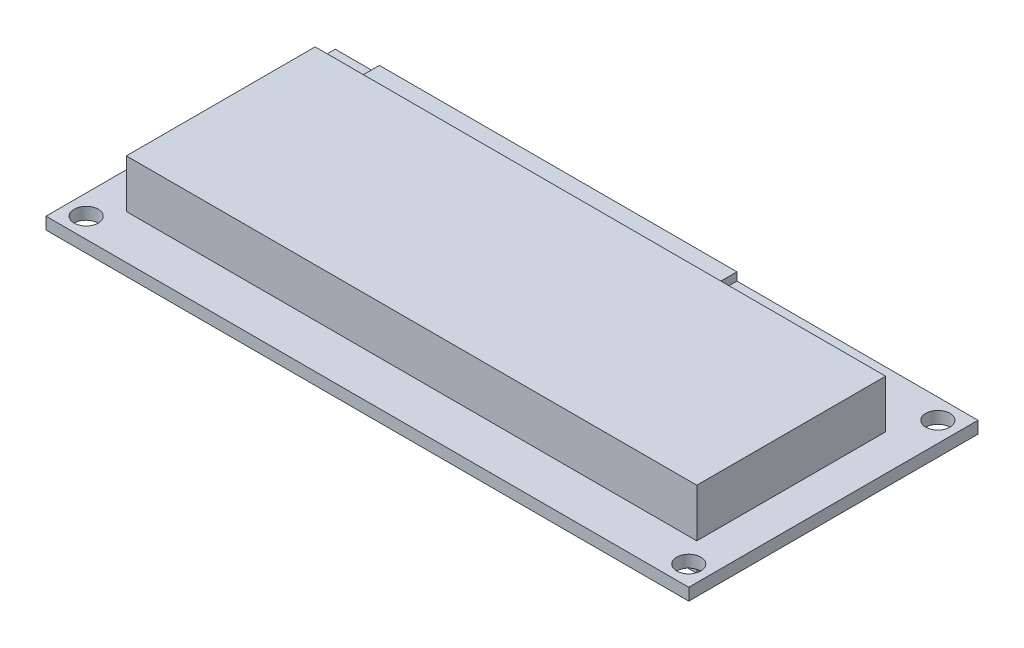
ISO-10303-21;
HEADER;
FILE_DESCRIPTION(('STEP AP214'),'2;1');
FILE_NAME('part.step','',(''),(''),'','','');
FILE_SCHEMA(('AUTOMOTIVE_DESIGN { 1 0 10303 214 1 1 1 1 }'));
ENDSEC;
DATA;
#1=APPLICATION_CONTEXT('core data for automotive mechanical design processes');
#2=APPLICATION_PROTOCOL_DEFINITION('international standard','automotive_design',2000,#1);
#3=PRODUCT_CONTEXT('',#1,'mechanical');
#4=PRODUCT('Part','Part','',(#3));
#5=PRODUCT_RELATED_PRODUCT_CATEGORY('part','',(#4));
#6=PRODUCT_DEFINITION_FORMATION('','',#4);
#7=PRODUCT_DEFINITION_CONTEXT('part definition',#1,'design');
#8=PRODUCT_DEFINITION('design','',#6,#7);
#9=PRODUCT_DEFINITION_SHAPE('','',#8);
#10=(LENGTH_UNIT() NAMED_UNIT(*) SI_UNIT(.MILLI.,.METRE.));
#11=(NAMED_UNIT(*) PLANE_ANGLE_UNIT() SI_UNIT($,.RADIAN.));
#12=(NAMED_UNIT(*) SI_UNIT($,.STERADIAN.) SOLID_ANGLE_UNIT());
#13=UNCERTAINTY_MEASURE_WITH_UNIT(LENGTH_MEASURE(1.E-05),#10,'distance_accuracy_value','');
#14=(GEOMETRIC_REPRESENTATION_CONTEXT(3) GLOBAL_UNCERTAINTY_ASSIGNED_CONTEXT((#13)) GLOBAL_UNIT_ASSIGNED_CONTEXT((#10,
#11,#12)) REPRESENTATION_CONTEXT('',''));
#15=CARTESIAN_POINT('',(0.,0.,0.));
#16=DIRECTION('',(0.,0.,1.));
#17=DIRECTION('',(1.,0.,0.));
#18=AXIS2_PLACEMENT_3D('',#15,#16,#17);
#19=CARTESIAN_POINT('',(0.,0.,0.));
#20=DIRECTION('',(0.,1.,0.));
#21=DIRECTION('',(0.,0.,1.));
#22=AXIS2_PLACEMENT_3D('',#19,#20,#21);
#23=PLANE('',#22);
#24=CARTESIAN_POINT('',(2.5,0.,33.5));
#25=DIRECTION('',(0.,1.,0.));
#26=DIRECTION('',(0.,0.,-1.));
#27=AXIS2_PLACEMENT_3D('',#24,#25,#26);
#28=CIRCLE('',#27,1.5);
#29=CARTESIAN_POINT('',(2.5,0.,32.));
#30=VERTEX_POINT('',#29);
#31=EDGE_CURVE('E244',#30,#30,#28,.T.);
#32=ORIENTED_EDGE('',*,*,#31,.T.);
#33=EDGE_LOOP('',(#32));
#34=FACE_BOUND('',#33,.T.);
#35=CARTESIAN_POINT('',(77.5,0.,33.5));
#36=DIRECTION('',(0.,1.,0.));
#37=DIRECTION('',(0.,0.,1.));
#38=AXIS2_PLACEMENT_3D('',#35,#36,#37);
#39=CIRCLE('',#38,1.5);
#40=CARTESIAN_POINT('',(77.5,0.,35.));
#41=VERTEX_POINT('',#40);
#42=EDGE_CURVE('E248',#41,#41,#39,.T.);
#43=ORIENTED_EDGE('',*,*,#42,.T.);
#44=EDGE_LOOP('',(#43));
#45=FACE_BOUND('',#44,.T.);
#46=CARTESIAN_POINT('',(77.5,0.,2.5));
#47=DIRECTION('',(0.,1.,0.));
#48=DIRECTION('',(0.,0.,-1.));
#49=AXIS2_PLACEMENT_3D('',#46,#47,#48);
#50=CIRCLE('',#49,1.5);
#51=CARTESIAN_POINT('',(77.5,0.,0.999999999999999));
#52=VERTEX_POINT('',#51);
#53=EDGE_CURVE('E254',#52,#52,#50,.T.);
#54=ORIENTED_EDGE('',*,*,#53,.T.);
#55=EDGE_LOOP('',(#54));
#56=FACE_BOUND('',#55,.T.);
#57=CARTESIAN_POINT('',(2.5,0.,2.5));
#58=DIRECTION('',(0.,1.,0.));
#59=DIRECTION('',(0.,0.,1.));
#60=AXIS2_PLACEMENT_3D('',#57,#58,#59);
#61=CIRCLE('',#60,1.5);
#62=CARTESIAN_POINT('',(2.5,0.,4.));
#63=VERTEX_POINT('',#62);
#64=EDGE_CURVE('E260',#63,#63,#61,.T.);
#65=ORIENTED_EDGE('',*,*,#64,.T.);
#66=EDGE_LOOP('',(#65));
#67=FACE_BOUND('',#66,.T.);
#68=DIRECTION('',(0.,0.,1.));
#69=VECTOR('',#68,1.);
#70=CARTESIAN_POINT('',(0.,0.,0.));
#71=LINE('',#70,#69);
#72=CARTESIAN_POINT('',(0.,0.,0.));
#73=VERTEX_POINT('',#72);
#74=CARTESIAN_POINT('',(0.,0.,36.));
#75=VERTEX_POINT('',#74);
#76=EDGE_CURVE('E266',#73,#75,#71,.T.);
#77=ORIENTED_EDGE('',*,*,#76,.F.);
#78=DIRECTION('',(-1.,0.,0.));
#79=VECTOR('',#78,1.);
#80=CARTESIAN_POINT('',(0.,0.,0.));
#81=LINE('',#80,#79);
#82=CARTESIAN_POINT('',(80.,0.,0.));
#83=VERTEX_POINT('',#82);
#84=EDGE_CURVE('E273',#83,#73,#81,.T.);
#85=ORIENTED_EDGE('',*,*,#84,.F.);
#86=DIRECTION('',(0.,0.,-1.));
#87=VECTOR('',#86,1.);
#88=CARTESIAN_POINT('',(80.,0.,0.));
#89=LINE('',#88,#87);
#90=CARTESIAN_POINT('',(80.,0.,36.));
#91=VERTEX_POINT('',#90);
#92=EDGE_CURVE('E285',#91,#83,#89,.T.);
#93=ORIENTED_EDGE('',*,*,#92,.F.);
#94=DIRECTION('',(1.,0.,0.));
#95=VECTOR('',#94,1.);
#96=CARTESIAN_POINT('',(0.,0.,36.));
#97=LINE('',#96,#95);
#98=EDGE_CURVE('E283',#75,#91,#97,.T.);
#99=ORIENTED_EDGE('',*,*,#98,.F.);
#100=EDGE_LOOP('',(#77,#85,#93,#99));
#101=FACE_BOUND('',#100,.T.);
#102=DIRECTION('',(0.,0.,1.));
#103=VECTOR('',#102,1.);
#104=CARTESIAN_POINT('',(4.5,0.,0.));
#105=LINE('',#104,#103);
#106=CARTESIAN_POINT('',(4.5,0.,7.));
#107=VERTEX_POINT('',#106);
#108=CARTESIAN_POINT('',(4.5,0.,30.5));
#109=VERTEX_POINT('',#108);
#110=EDGE_CURVE('E49',#107,#109,#105,.T.);
#111=ORIENTED_EDGE('',*,*,#110,.T.);
#112=DIRECTION('',(1.,0.,0.));
#113=VECTOR('',#112,1.);
#114=CARTESIAN_POINT('',(0.,0.,30.5));
#115=LINE('',#114,#113);
#116=CARTESIAN_POINT('',(75.5,0.,30.5));
#117=VERTEX_POINT('',#116);
#118=EDGE_CURVE('E11',#109,#117,#115,.T.);
#119=ORIENTED_EDGE('',*,*,#118,.T.);
#120=DIRECTION('',(0.,0.,-1.));
#121=VECTOR('',#120,1.);
#122=CARTESIAN_POINT('',(75.5,0.,0.));
#123=LINE('',#122,#121);
#124=CARTESIAN_POINT('',(75.5,0.,7.));
#125=VERTEX_POINT('',#124);
#126=EDGE_CURVE('E56',#117,#125,#123,.T.);
#127=ORIENTED_EDGE('',*,*,#126,.T.);
#128=DIRECTION('',(-1.,0.,0.));
#129=VECTOR('',#128,1.);
#130=CARTESIAN_POINT('',(0.,0.,7.));
#131=LINE('',#130,#129);
#132=EDGE_CURVE('E300',#125,#107,#131,.T.);
#133=ORIENTED_EDGE('',*,*,#132,.T.);
#134=EDGE_LOOP('',(#111,#119,#127,#133));
#135=FACE_BOUND('',#134,.T.);
#136=ADVANCED_FACE('F41',(#34,#45,#56,#67,#101,#135),#23,.F.);
#137=CARTESIAN_POINT('',(0.,1.5,0.));
#138=DIRECTION('',(0.,1.,0.));
#139=DIRECTION('',(0.,0.,1.));
#140=AXIS2_PLACEMENT_3D('',#137,#138,#139);
#141=PLANE('',#140);
#142=DIRECTION('',(0.,0.,1.));
#143=VECTOR('',#142,1.);
#144=CARTESIAN_POINT('',(50.,1.5,0.));
#145=LINE('',#144,#143);
#146=CARTESIAN_POINT('',(50.,1.5,0.));
#147=VERTEX_POINT('',#146);
#148=CARTESIAN_POINT('',(50.,1.5,3.5));
#149=VERTEX_POINT('',#148);
#150=EDGE_CURVE('E64',#147,#149,#145,.T.);
#151=ORIENTED_EDGE('',*,*,#150,.T.);
#152=DIRECTION('',(1.,0.,0.));
#153=VECTOR('',#152,1.);
#154=CARTESIAN_POINT('',(5.5,1.5,3.5));
#155=LINE('',#154,#153);
#156=CARTESIAN_POINT('',(5.5,1.5,3.5));
#157=VERTEX_POINT('',#156);
#158=EDGE_CURVE('E184',#157,#149,#155,.T.);
#159=ORIENTED_EDGE('',*,*,#158,.F.);
#160=DIRECTION('',(0.,0.,1.));
#161=VECTOR('',#160,1.);
#162=CARTESIAN_POINT('',(5.5,1.5,0.));
#163=LINE('',#162,#161);
#164=CARTESIAN_POINT('',(5.5,1.5,0.));
#165=VERTEX_POINT('',#164);
#166=EDGE_CURVE('E189',#165,#157,#163,.T.);
#167=ORIENTED_EDGE('',*,*,#166,.F.);
#168=DIRECTION('',(-1.,0.,0.));
#169=VECTOR('',#168,1.);
#170=CARTESIAN_POINT('',(0.,1.5,0.));
#171=LINE('',#170,#169);
#172=CARTESIAN_POINT('',(0.,1.5,0.));
#173=VERTEX_POINT('',#172);
#174=EDGE_CURVE('E277',#165,#173,#171,.T.);
#175=ORIENTED_EDGE('',*,*,#174,.T.);
#176=DIRECTION('',(0.,0.,1.));
#177=VECTOR('',#176,1.);
#178=CARTESIAN_POINT('',(0.,1.5,0.));
#179=LINE('',#178,#177);
#180=CARTESIAN_POINT('',(0.,1.5,36.));
#181=VERTEX_POINT('',#180);
#182=EDGE_CURVE('E269',#173,#181,#179,.T.);
#183=ORIENTED_EDGE('',*,*,#182,.T.);
#184=DIRECTION('',(1.,0.,0.));
#185=VECTOR('',#184,1.);
#186=CARTESIAN_POINT('',(0.,1.5,36.));
#187=LINE('',#186,#185);
#188=CARTESIAN_POINT('',(80.,1.5,36.));
#189=VERTEX_POINT('',#188);
#190=EDGE_CURVE('E272',#181,#189,#187,.T.);
#191=ORIENTED_EDGE('',*,*,#190,.T.);
#192=DIRECTION('',(0.,0.,-1.));
#193=VECTOR('',#192,1.);
#194=CARTESIAN_POINT('',(80.,1.5,0.));
#195=LINE('',#194,#193);
#196=CARTESIAN_POINT('',(80.,1.5,0.));
#197=VERTEX_POINT('',#196);
#198=EDGE_CURVE('E275',#189,#197,#195,.T.);
#199=ORIENTED_EDGE('',*,*,#198,.T.);
#200=EDGE_CURVE('E278',#197,#147,#171,.T.);
#201=ORIENTED_EDGE('',*,*,#200,.T.);
#202=EDGE_LOOP('',(#151,#159,#167,#175,#183,#191,#199,#201));
#203=FACE_BOUND('',#202,.T.);
#204=DIRECTION('',(0.,0.,1.));
#205=VECTOR('',#204,1.);
#206=CARTESIAN_POINT('',(4.5,1.5,7.));
#207=LINE('',#206,#205);
#208=CARTESIAN_POINT('',(4.5,1.5,7.));
#209=VERTEX_POINT('',#208);
#210=CARTESIAN_POINT('',(4.5,1.5,30.5));
#211=VERTEX_POINT('',#210);
#212=EDGE_CURVE('E213',#209,#211,#207,.T.);
#213=ORIENTED_EDGE('',*,*,#212,.F.);
#214=DIRECTION('',(-1.,0.,0.));
#215=VECTOR('',#214,1.);
#216=CARTESIAN_POINT('',(4.5,1.5,7.));
#217=LINE('',#216,#215);
#218=CARTESIAN_POINT('',(75.5,1.5,7.));
#219=VERTEX_POINT('',#218);
#220=EDGE_CURVE('E218',#219,#209,#217,.T.);
#221=ORIENTED_EDGE('',*,*,#220,.F.);
#222=DIRECTION('',(0.,0.,-1.));
#223=VECTOR('',#222,1.);
#224=CARTESIAN_POINT('',(75.5,1.5,7.));
#225=LINE('',#224,#223);
#226=CARTESIAN_POINT('',(75.5,1.5,30.5));
#227=VERTEX_POINT('',#226);
#228=EDGE_CURVE('E229',#227,#219,#225,.T.);
#229=ORIENTED_EDGE('',*,*,#228,.F.);
#230=DIRECTION('',(1.,0.,0.));
#231=VECTOR('',#230,1.);
#232=CARTESIAN_POINT('',(4.5,1.5,30.5));
#233=LINE('',#232,#231);
#234=EDGE_CURVE('E226',#211,#227,#233,.T.);
#235=ORIENTED_EDGE('',*,*,#234,.F.);
#236=EDGE_LOOP('',(#213,#221,#229,#235));
#237=FACE_BOUND('',#236,.T.);
#238=CARTESIAN_POINT('',(77.5,1.5,33.5));
#239=DIRECTION('',(0.,1.,0.));
#240=DIRECTION('',(0.,0.,1.));
#241=AXIS2_PLACEMENT_3D('',#238,#239,#240);
#242=CIRCLE('',#241,1.5);
#243=CARTESIAN_POINT('',(77.5,1.5,35.));
#244=VERTEX_POINT('',#243);
#245=EDGE_CURVE('E251',#244,#244,#242,.T.);
#246=ORIENTED_EDGE('',*,*,#245,.F.);
#247=EDGE_LOOP('',(#246));
#248=FACE_BOUND('',#247,.T.);
#249=CARTESIAN_POINT('',(2.5,1.5,2.5));
#250=DIRECTION('',(0.,1.,0.));
#251=DIRECTION('',(0.,0.,1.));
#252=AXIS2_PLACEMENT_3D('',#249,#250,#251);
#253=CIRCLE('',#252,1.5);
#254=CARTESIAN_POINT('',(2.5,1.5,4.));
#255=VERTEX_POINT('',#254);
#256=EDGE_CURVE('E263',#255,#255,#253,.T.);
#257=ORIENTED_EDGE('',*,*,#256,.F.);
#258=EDGE_LOOP('',(#257));
#259=FACE_BOUND('',#258,.T.);
#260=CARTESIAN_POINT('',(77.5,1.5,2.5));
#261=DIRECTION('',(0.,1.,0.));
#262=DIRECTION('',(0.,0.,-1.));
#263=AXIS2_PLACEMENT_3D('',#260,#261,#262);
#264=CIRCLE('',#263,1.5);
#265=CARTESIAN_POINT('',(77.5,1.5,0.999999999999999));
#266=VERTEX_POINT('',#265);
#267=EDGE_CURVE('E257',#266,#266,#264,.T.);
#268=ORIENTED_EDGE('',*,*,#267,.F.);
#269=EDGE_LOOP('',(#268));
#270=FACE_BOUND('',#269,.T.);
#271=CARTESIAN_POINT('',(2.5,1.5,33.5));
#272=DIRECTION('',(0.,1.,0.));
#273=DIRECTION('',(0.,0.,-1.));
#274=AXIS2_PLACEMENT_3D('',#271,#272,#273);
#275=CIRCLE('',#274,1.5);
#276=CARTESIAN_POINT('',(2.5,1.5,32.));
#277=VERTEX_POINT('',#276);
#278=EDGE_CURVE('E245',#277,#277,#275,.T.);
#279=ORIENTED_EDGE('',*,*,#278,.F.);
#280=EDGE_LOOP('',(#279));
#281=FACE_BOUND('',#280,.T.);
#282=ADVANCED_FACE('F320',(#203,#237,#248,#259,#270,#281),#141,.T.);
#283=CARTESIAN_POINT('',(0.,1.5,0.));
#284=DIRECTION('',(1.,0.,0.));
#285=DIRECTION('',(0.,0.,-1.));
#286=AXIS2_PLACEMENT_3D('',#283,#284,#285);
#287=PLANE('',#286);
#288=ORIENTED_EDGE('',*,*,#76,.T.);
#289=DIRECTION('',(0.,-1.,0.));
#290=VECTOR('',#289,1.);
#291=CARTESIAN_POINT('',(0.,1.5,36.));
#292=LINE('',#291,#290);
#293=EDGE_CURVE('E296',#181,#75,#292,.T.);
#294=ORIENTED_EDGE('',*,*,#293,.F.);
#295=ORIENTED_EDGE('',*,*,#182,.F.);
#296=DIRECTION('',(0.,-1.,0.));
#297=VECTOR('',#296,1.);
#298=CARTESIAN_POINT('',(0.,1.5,0.));
#299=LINE('',#298,#297);
#300=EDGE_CURVE('E280',#173,#73,#299,.T.);
#301=ORIENTED_EDGE('',*,*,#300,.T.);
#302=EDGE_LOOP('',(#288,#294,#295,#301));
#303=FACE_BOUND('',#302,.T.);
#304=ADVANCED_FACE('F43',(#303),#287,.F.);
#305=CARTESIAN_POINT('',(0.,1.5,36.));
#306=DIRECTION('',(0.,0.,-1.));
#307=DIRECTION('',(-1.,0.,0.));
#308=AXIS2_PLACEMENT_3D('',#305,#306,#307);
#309=PLANE('',#308);
#310=ORIENTED_EDGE('',*,*,#98,.T.);
#311=DIRECTION('',(0.,-1.,0.));
#312=VECTOR('',#311,1.);
#313=CARTESIAN_POINT('',(80.,1.5,36.));
#314=LINE('',#313,#312);
#315=EDGE_CURVE('E293',#189,#91,#314,.T.);
#316=ORIENTED_EDGE('',*,*,#315,.F.);
#317=ORIENTED_EDGE('',*,*,#190,.F.);
#318=ORIENTED_EDGE('',*,*,#293,.T.);
#319=EDGE_LOOP('',(#310,#316,#317,#318));
#320=FACE_BOUND('',#319,.T.);
#321=ADVANCED_FACE('F337',(#320),#309,.F.);
#322=CARTESIAN_POINT('',(80.,1.5,0.));
#323=DIRECTION('',(-1.,0.,0.));
#324=DIRECTION('',(0.,0.,1.));
#325=AXIS2_PLACEMENT_3D('',#322,#323,#324);
#326=PLANE('',#325);
#327=ORIENTED_EDGE('',*,*,#92,.T.);
#328=DIRECTION('',(0.,-1.,0.));
#329=VECTOR('',#328,1.);
#330=CARTESIAN_POINT('',(80.,1.5,0.));
#331=LINE('',#330,#329);
#332=EDGE_CURVE('E290',#197,#83,#331,.T.);
#333=ORIENTED_EDGE('',*,*,#332,.F.);
#334=ORIENTED_EDGE('',*,*,#198,.F.);
#335=ORIENTED_EDGE('',*,*,#315,.T.);
#336=EDGE_LOOP('',(#327,#333,#334,#335));
#337=FACE_BOUND('',#336,.T.);
#338=ADVANCED_FACE('F334',(#337),#326,.F.);
#339=CARTESIAN_POINT('',(0.,1.5,0.));
#340=DIRECTION('',(0.,0.,1.));
#341=DIRECTION('',(1.,0.,0.));
#342=AXIS2_PLACEMENT_3D('',#339,#340,#341);
#343=PLANE('',#342);
#344=ORIENTED_EDGE('',*,*,#84,.T.);
#345=ORIENTED_EDGE('',*,*,#300,.F.);
#346=ORIENTED_EDGE('',*,*,#174,.F.);
#347=DIRECTION('',(0.,-1.,0.));
#348=VECTOR('',#347,1.);
#349=CARTESIAN_POINT('',(5.5,2.5,0.));
#350=LINE('',#349,#348);
#351=CARTESIAN_POINT('',(5.5,2.5,0.));
#352=VERTEX_POINT('',#351);
#353=EDGE_CURVE('E205',#352,#165,#350,.T.);
#354=ORIENTED_EDGE('',*,*,#353,.F.);
#355=DIRECTION('',(1.,0.,0.));
#356=VECTOR('',#355,1.);
#357=CARTESIAN_POINT('',(5.5,2.5,0.));
#358=LINE('',#357,#356);
#359=CARTESIAN_POINT('',(50.,2.5,0.));
#360=VERTEX_POINT('',#359);
#361=EDGE_CURVE('E192',#352,#360,#358,.T.);
#362=ORIENTED_EDGE('',*,*,#361,.T.);
#363=DIRECTION('',(0.,-1.,0.));
#364=VECTOR('',#363,1.);
#365=CARTESIAN_POINT('',(50.,2.5,0.));
#366=LINE('',#365,#364);
#367=EDGE_CURVE('E208',#360,#147,#366,.T.);
#368=ORIENTED_EDGE('',*,*,#367,.T.);
#369=ORIENTED_EDGE('',*,*,#200,.F.);
#370=ORIENTED_EDGE('',*,*,#332,.T.);
#371=EDGE_LOOP('',(#344,#345,#346,#354,#362,#368,#369,#370));
#372=FACE_BOUND('',#371,.T.);
#373=ADVANCED_FACE('F330',(#372),#343,.F.);
#374=CARTESIAN_POINT('',(2.5,1.5,2.5));
#375=DIRECTION('',(0.,-1.,0.));
#376=DIRECTION('',(0.,0.,-1.));
#377=AXIS2_PLACEMENT_3D('',#374,#375,#376);
#378=CYLINDRICAL_SURFACE('',#377,1.5);
#379=ORIENTED_EDGE('',*,*,#256,.T.);
#380=EDGE_LOOP('',(#379));
#381=FACE_BOUND('',#380,.T.);
#382=ORIENTED_EDGE('',*,*,#64,.F.);
#383=EDGE_LOOP('',(#382));
#384=FACE_BOUND('',#383,.T.);
#385=ADVANCED_FACE('F333',(#381,#384),#378,.F.);
#386=CARTESIAN_POINT('',(77.5,1.5,2.5));
#387=DIRECTION('',(0.,-1.,0.));
#388=DIRECTION('',(0.,0.,-1.));
#389=AXIS2_PLACEMENT_3D('',#386,#387,#388);
#390=CYLINDRICAL_SURFACE('',#389,1.5);
#391=ORIENTED_EDGE('',*,*,#267,.T.);
#392=EDGE_LOOP('',(#391));
#393=FACE_BOUND('',#392,.T.);
#394=ORIENTED_EDGE('',*,*,#53,.F.);
#395=EDGE_LOOP('',(#394));
#396=FACE_BOUND('',#395,.T.);
#397=ADVANCED_FACE('F405',(#393,#396),#390,.F.);
#398=CARTESIAN_POINT('',(77.5,1.5,33.5));
#399=DIRECTION('',(0.,-1.,0.));
#400=DIRECTION('',(0.,0.,-1.));
#401=AXIS2_PLACEMENT_3D('',#398,#399,#400);
#402=CYLINDRICAL_SURFACE('',#401,1.5);
#403=ORIENTED_EDGE('',*,*,#245,.T.);
#404=EDGE_LOOP('',(#403));
#405=FACE_BOUND('',#404,.T.);
#406=ORIENTED_EDGE('',*,*,#42,.F.);
#407=EDGE_LOOP('',(#406));
#408=FACE_BOUND('',#407,.T.);
#409=ADVANCED_FACE('F401',(#405,#408),#402,.F.);
#410=CARTESIAN_POINT('',(2.5,1.5,33.5));
#411=DIRECTION('',(0.,-1.,0.));
#412=DIRECTION('',(0.,0.,-1.));
#413=AXIS2_PLACEMENT_3D('',#410,#411,#412);
#414=CYLINDRICAL_SURFACE('',#413,1.5);
#415=ORIENTED_EDGE('',*,*,#278,.T.);
#416=EDGE_LOOP('',(#415));
#417=FACE_BOUND('',#416,.T.);
#418=ORIENTED_EDGE('',*,*,#31,.F.);
#419=EDGE_LOOP('',(#418));
#420=FACE_BOUND('',#419,.T.);
#421=ADVANCED_FACE('F397',(#417,#420),#414,.F.);
#422=CARTESIAN_POINT('',(4.5,7.5,7.));
#423=DIRECTION('',(1.,0.,0.));
#424=DIRECTION('',(0.,0.,-1.));
#425=AXIS2_PLACEMENT_3D('',#422,#423,#424);
#426=PLANE('',#425);
#427=ORIENTED_EDGE('',*,*,#212,.T.);
#428=DIRECTION('',(0.,-1.,0.));
#429=VECTOR('',#428,1.);
#430=CARTESIAN_POINT('',(4.5,7.5,30.5));
#431=LINE('',#430,#429);
#432=CARTESIAN_POINT('',(4.5,7.5,30.5));
#433=VERTEX_POINT('',#432);
#434=EDGE_CURVE('E241',#433,#211,#431,.T.);
#435=ORIENTED_EDGE('',*,*,#434,.F.);
#436=DIRECTION('',(0.,0.,1.));
#437=VECTOR('',#436,1.);
#438=CARTESIAN_POINT('',(4.5,7.5,7.));
#439=LINE('',#438,#437);
#440=CARTESIAN_POINT('',(4.5,7.5,7.));
#441=VERTEX_POINT('',#440);
#442=EDGE_CURVE('E214',#441,#433,#439,.T.);
#443=ORIENTED_EDGE('',*,*,#442,.F.);
#444=DIRECTION('',(0.,-1.,0.));
#445=VECTOR('',#444,1.);
#446=CARTESIAN_POINT('',(4.5,7.5,7.));
#447=LINE('',#446,#445);
#448=EDGE_CURVE('E224',#441,#209,#447,.T.);
#449=ORIENTED_EDGE('',*,*,#448,.T.);
#450=EDGE_LOOP('',(#427,#435,#443,#449));
#451=FACE_BOUND('',#450,.T.);
#452=ADVANCED_FACE('F393',(#451),#426,.F.);
#453=CARTESIAN_POINT('',(4.5,7.5,30.5));
#454=DIRECTION('',(0.,0.,-1.));
#455=DIRECTION('',(-1.,0.,0.));
#456=AXIS2_PLACEMENT_3D('',#453,#454,#455);
#457=PLANE('',#456);
#458=ORIENTED_EDGE('',*,*,#234,.T.);
#459=DIRECTION('',(0.,-1.,0.));
#460=VECTOR('',#459,1.);
#461=CARTESIAN_POINT('',(75.5,7.5,30.5));
#462=LINE('',#461,#460);
#463=CARTESIAN_POINT('',(75.5,7.5,30.5));
#464=VERTEX_POINT('',#463);
#465=EDGE_CURVE('E238',#464,#227,#462,.T.);
#466=ORIENTED_EDGE('',*,*,#465,.F.);
#467=DIRECTION('',(1.,0.,0.));
#468=VECTOR('',#467,1.);
#469=CARTESIAN_POINT('',(4.5,7.5,30.5));
#470=LINE('',#469,#468);
#471=EDGE_CURVE('E217',#433,#464,#470,.T.);
#472=ORIENTED_EDGE('',*,*,#471,.F.);
#473=ORIENTED_EDGE('',*,*,#434,.T.);
#474=EDGE_LOOP('',(#458,#466,#472,#473));
#475=FACE_BOUND('',#474,.T.);
#476=ADVANCED_FACE('F389',(#475),#457,.F.);
#477=CARTESIAN_POINT('',(75.5,7.5,7.));
#478=DIRECTION('',(-1.,0.,0.));
#479=DIRECTION('',(0.,0.,1.));
#480=AXIS2_PLACEMENT_3D('',#477,#478,#479);
#481=PLANE('',#480);
#482=ORIENTED_EDGE('',*,*,#228,.T.);
#483=DIRECTION('',(0.,-1.,0.));
#484=VECTOR('',#483,1.);
#485=CARTESIAN_POINT('',(75.5,7.5,7.));
#486=LINE('',#485,#484);
#487=CARTESIAN_POINT('',(75.5,7.5,7.));
#488=VERTEX_POINT('',#487);
#489=EDGE_CURVE('E235',#488,#219,#486,.T.);
#490=ORIENTED_EDGE('',*,*,#489,.F.);
#491=DIRECTION('',(0.,0.,-1.));
#492=VECTOR('',#491,1.);
#493=CARTESIAN_POINT('',(75.5,7.5,7.));
#494=LINE('',#493,#492);
#495=EDGE_CURVE('E220',#464,#488,#494,.T.);
#496=ORIENTED_EDGE('',*,*,#495,.F.);
#497=ORIENTED_EDGE('',*,*,#465,.T.);
#498=EDGE_LOOP('',(#482,#490,#496,#497));
#499=FACE_BOUND('',#498,.T.);
#500=ADVANCED_FACE('F386',(#499),#481,.F.);
#501=CARTESIAN_POINT('',(4.5,7.5,7.));
#502=DIRECTION('',(0.,0.,1.));
#503=DIRECTION('',(1.,0.,0.));
#504=AXIS2_PLACEMENT_3D('',#501,#502,#503);
#505=PLANE('',#504);
#506=ORIENTED_EDGE('',*,*,#220,.T.);
#507=ORIENTED_EDGE('',*,*,#448,.F.);
#508=DIRECTION('',(-1.,0.,0.));
#509=VECTOR('',#508,1.);
#510=CARTESIAN_POINT('',(4.5,7.5,7.));
#511=LINE('',#510,#509);
#512=EDGE_CURVE('E222',#488,#441,#511,.T.);
#513=ORIENTED_EDGE('',*,*,#512,.F.);
#514=ORIENTED_EDGE('',*,*,#489,.T.);
#515=EDGE_LOOP('',(#506,#507,#513,#514));
#516=FACE_BOUND('',#515,.T.);
#517=ADVANCED_FACE('F379',(#516),#505,.F.);
#518=CARTESIAN_POINT('',(0.,7.5,0.));
#519=DIRECTION('',(0.,1.,0.));
#520=DIRECTION('',(0.,0.,1.));
#521=AXIS2_PLACEMENT_3D('',#518,#519,#520);
#522=PLANE('',#521);
#523=ORIENTED_EDGE('',*,*,#442,.T.);
#524=ORIENTED_EDGE('',*,*,#471,.T.);
#525=ORIENTED_EDGE('',*,*,#495,.T.);
#526=ORIENTED_EDGE('',*,*,#512,.T.);
#527=EDGE_LOOP('',(#523,#524,#525,#526));
#528=FACE_BOUND('',#527,.T.);
#529=ADVANCED_FACE('F372',(#528),#522,.T.);
#530=CARTESIAN_POINT('',(5.5,2.5,3.5));
#531=DIRECTION('',(0.,0.,-1.));
#532=DIRECTION('',(-1.,0.,0.));
#533=AXIS2_PLACEMENT_3D('',#530,#531,#532);
#534=PLANE('',#533);
#535=ORIENTED_EDGE('',*,*,#158,.T.);
#536=DIRECTION('',(0.,-1.,0.));
#537=VECTOR('',#536,1.);
#538=CARTESIAN_POINT('',(50.,2.5,3.5));
#539=LINE('',#538,#537);
#540=CARTESIAN_POINT('',(50.,2.5,3.5));
#541=VERTEX_POINT('',#540);
#542=EDGE_CURVE('E211',#541,#149,#539,.T.);
#543=ORIENTED_EDGE('',*,*,#542,.F.);
#544=DIRECTION('',(1.,0.,0.));
#545=VECTOR('',#544,1.);
#546=CARTESIAN_POINT('',(5.5,2.5,3.5));
#547=LINE('',#546,#545);
#548=CARTESIAN_POINT('',(5.5,2.5,3.5));
#549=VERTEX_POINT('',#548);
#550=EDGE_CURVE('E186',#549,#541,#547,.T.);
#551=ORIENTED_EDGE('',*,*,#550,.F.);
#552=DIRECTION('',(0.,-1.,0.));
#553=VECTOR('',#552,1.);
#554=CARTESIAN_POINT('',(5.5,2.5,3.5));
#555=LINE('',#554,#553);
#556=EDGE_CURVE('E197',#549,#157,#555,.T.);
#557=ORIENTED_EDGE('',*,*,#556,.T.);
#558=EDGE_LOOP('',(#535,#543,#551,#557));
#559=FACE_BOUND('',#558,.T.);
#560=ADVANCED_FACE('F370',(#559),#534,.F.);
#561=CARTESIAN_POINT('',(50.,2.5,0.));
#562=DIRECTION('',(1.,0.,0.));
#563=DIRECTION('',(0.,0.,-1.));
#564=AXIS2_PLACEMENT_3D('',#561,#562,#563);
#565=PLANE('',#564);
#566=ORIENTED_EDGE('',*,*,#150,.F.);
#567=ORIENTED_EDGE('',*,*,#367,.F.);
#568=DIRECTION('',(0.,0.,1.));
#569=VECTOR('',#568,1.);
#570=CARTESIAN_POINT('',(50.,2.5,0.));
#571=LINE('',#570,#569);
#572=EDGE_CURVE('E188',#360,#541,#571,.T.);
#573=ORIENTED_EDGE('',*,*,#572,.T.);
#574=ORIENTED_EDGE('',*,*,#542,.T.);
#575=EDGE_LOOP('',(#566,#567,#573,#574));
#576=FACE_BOUND('',#575,.T.);
#577=ADVANCED_FACE('F368',(#576),#565,.T.);
#578=CARTESIAN_POINT('',(5.5,2.5,0.));
#579=DIRECTION('',(1.,0.,0.));
#580=DIRECTION('',(0.,0.,-1.));
#581=AXIS2_PLACEMENT_3D('',#578,#579,#580);
#582=PLANE('',#581);
#583=ORIENTED_EDGE('',*,*,#166,.T.);
#584=ORIENTED_EDGE('',*,*,#556,.F.);
#585=DIRECTION('',(0.,0.,1.));
#586=VECTOR('',#585,1.);
#587=CARTESIAN_POINT('',(5.5,2.5,0.));
#588=LINE('',#587,#586);
#589=EDGE_CURVE('E195',#352,#549,#588,.T.);
#590=ORIENTED_EDGE('',*,*,#589,.F.);
#591=ORIENTED_EDGE('',*,*,#353,.T.);
#592=EDGE_LOOP('',(#583,#584,#590,#591));
#593=FACE_BOUND('',#592,.T.);
#594=ADVANCED_FACE('F362',(#593),#582,.F.);
#595=CARTESIAN_POINT('',(0.,2.5,0.));
#596=DIRECTION('',(0.,-1.,0.));
#597=DIRECTION('',(0.,0.,-1.));
#598=AXIS2_PLACEMENT_3D('',#595,#596,#597);
#599=PLANE('',#598);
#600=ORIENTED_EDGE('',*,*,#550,.T.);
#601=ORIENTED_EDGE('',*,*,#572,.F.);
#602=ORIENTED_EDGE('',*,*,#361,.F.);
#603=ORIENTED_EDGE('',*,*,#589,.T.);
#604=EDGE_LOOP('',(#600,#601,#602,#603));
#605=FACE_BOUND('',#604,.T.);
#606=ADVANCED_FACE('F316',(#605),#599,.F.);
#607=CARTESIAN_POINT('',(4.5,-2.,7.));
#608=DIRECTION('',(-1.,0.,0.));
#609=DIRECTION('',(0.,0.,1.));
#610=AXIS2_PLACEMENT_3D('',#607,#608,#609);
#611=PLANE('',#610);
#612=ORIENTED_EDGE('',*,*,#110,.F.);
#613=DIRECTION('',(0.,1.,0.));
#614=VECTOR('',#613,1.);
#615=CARTESIAN_POINT('',(4.5,-2.,7.));
#616=LINE('',#615,#614);
#617=CARTESIAN_POINT('',(4.5,-2.,7.));
#618=VERTEX_POINT('',#617);
#619=EDGE_CURVE('E181',#618,#107,#616,.T.);
#620=ORIENTED_EDGE('',*,*,#619,.F.);
#621=DIRECTION('',(0.,0.,1.));
#622=VECTOR('',#621,1.);
#623=CARTESIAN_POINT('',(4.5,-2.,7.));
#624=LINE('',#623,#622);
#625=CARTESIAN_POINT('',(4.5,-2.,30.5));
#626=VERTEX_POINT('',#625);
#627=EDGE_CURVE('E164',#618,#626,#624,.T.);
#628=ORIENTED_EDGE('',*,*,#627,.T.);
#629=DIRECTION('',(0.,1.,0.));
#630=VECTOR('',#629,1.);
#631=CARTESIAN_POINT('',(4.5,-2.,30.5));
#632=LINE('',#631,#630);
#633=EDGE_CURVE('E170',#626,#109,#632,.T.);
#634=ORIENTED_EDGE('',*,*,#633,.T.);
#635=EDGE_LOOP('',(#612,#620,#628,#634));
#636=FACE_BOUND('',#635,.T.);
#637=ADVANCED_FACE('F304',(#636),#611,.T.);
#638=CARTESIAN_POINT('',(4.5,-2.,7.));
#639=DIRECTION('',(0.,0.,-1.));
#640=DIRECTION('',(-1.,0.,0.));
#641=AXIS2_PLACEMENT_3D('',#638,#639,#640);
#642=PLANE('',#641);
#643=ORIENTED_EDGE('',*,*,#132,.F.);
#644=DIRECTION('',(0.,1.,0.));
#645=VECTOR('',#644,1.);
#646=CARTESIAN_POINT('',(75.5,-2.,7.));
#647=LINE('',#646,#645);
#648=CARTESIAN_POINT('',(75.5,-2.,7.));
#649=VERTEX_POINT('',#648);
#650=EDGE_CURVE('E180',#649,#125,#647,.T.);
#651=ORIENTED_EDGE('',*,*,#650,.F.);
#652=DIRECTION('',(-1.,0.,0.));
#653=VECTOR('',#652,1.);
#654=CARTESIAN_POINT('',(4.5,-2.,7.));
#655=LINE('',#654,#653);
#656=EDGE_CURVE('E163',#649,#618,#655,.T.);
#657=ORIENTED_EDGE('',*,*,#656,.T.);
#658=ORIENTED_EDGE('',*,*,#619,.T.);
#659=EDGE_LOOP('',(#643,#651,#657,#658));
#660=FACE_BOUND('',#659,.T.);
#661=ADVANCED_FACE('F306',(#660),#642,.T.);
#662=CARTESIAN_POINT('',(75.5,-2.,7.));
#663=DIRECTION('',(1.,0.,0.));
#664=DIRECTION('',(0.,0.,-1.));
#665=AXIS2_PLACEMENT_3D('',#662,#663,#664);
#666=PLANE('',#665);
#667=ORIENTED_EDGE('',*,*,#126,.F.);
#668=DIRECTION('',(0.,1.,0.));
#669=VECTOR('',#668,1.);
#670=CARTESIAN_POINT('',(75.5,-2.,30.5));
#671=LINE('',#670,#669);
#672=CARTESIAN_POINT('',(75.5,-2.,30.5));
#673=VERTEX_POINT('',#672);
#674=EDGE_CURVE('E166',#673,#117,#671,.T.);
#675=ORIENTED_EDGE('',*,*,#674,.F.);
#676=DIRECTION('',(0.,0.,-1.));
#677=VECTOR('',#676,1.);
#678=CARTESIAN_POINT('',(75.5,-2.,7.));
#679=LINE('',#678,#677);
#680=EDGE_CURVE('E157',#673,#649,#679,.T.);
#681=ORIENTED_EDGE('',*,*,#680,.T.);
#682=ORIENTED_EDGE('',*,*,#650,.T.);
#683=EDGE_LOOP('',(#667,#675,#681,#682));
#684=FACE_BOUND('',#683,.T.);
#685=ADVANCED_FACE('F167',(#684),#666,.T.);
#686=CARTESIAN_POINT('',(0.,-2.,0.));
#687=DIRECTION('',(0.,1.,0.));
#688=DIRECTION('',(0.,0.,1.));
#689=AXIS2_PLACEMENT_3D('',#686,#687,#688);
#690=PLANE('',#689);
#691=ORIENTED_EDGE('',*,*,#627,.F.);
#692=ORIENTED_EDGE('',*,*,#656,.F.);
#693=ORIENTED_EDGE('',*,*,#680,.F.);
#694=DIRECTION('',(1.,0.,0.));
#695=VECTOR('',#694,1.);
#696=CARTESIAN_POINT('',(4.5,-2.,30.5));
#697=LINE('',#696,#695);
#698=EDGE_CURVE('E161',#626,#673,#697,.T.);
#699=ORIENTED_EDGE('',*,*,#698,.F.);
#700=EDGE_LOOP('',(#691,#692,#693,#699));
#701=FACE_BOUND('',#700,.T.);
#702=ADVANCED_FACE('F159',(#701),#690,.F.);
#703=CARTESIAN_POINT('',(4.5,-2.,30.5));
#704=DIRECTION('',(0.,0.,1.));
#705=DIRECTION('',(1.,0.,0.));
#706=AXIS2_PLACEMENT_3D('',#703,#704,#705);
#707=PLANE('',#706);
#708=ORIENTED_EDGE('',*,*,#118,.F.);
#709=ORIENTED_EDGE('',*,*,#633,.F.);
#710=ORIENTED_EDGE('',*,*,#698,.T.);
#711=ORIENTED_EDGE('',*,*,#674,.T.);
#712=EDGE_LOOP('',(#708,#709,#710,#711));
#713=FACE_BOUND('',#712,.T.);
#714=ADVANCED_FACE('F173',(#713),#707,.T.);
#715=CLOSED_SHELL('',(#136,#282,#304,#321,#338,#373,#385,#397,#409,#421,#452,#476,#500,#517,
#529,#560,#577,#594,#606,#637,#661,#685,#702,#714));
#716=MANIFOLD_SOLID_BREP('B2',#715);
#717=ADVANCED_BREP_SHAPE_REPRESENTATION('',(#18,#716),#14);
#718=SHAPE_DEFINITION_REPRESENTATION(#9,#717);
ENDSEC;
END-ISO-10303-21;
